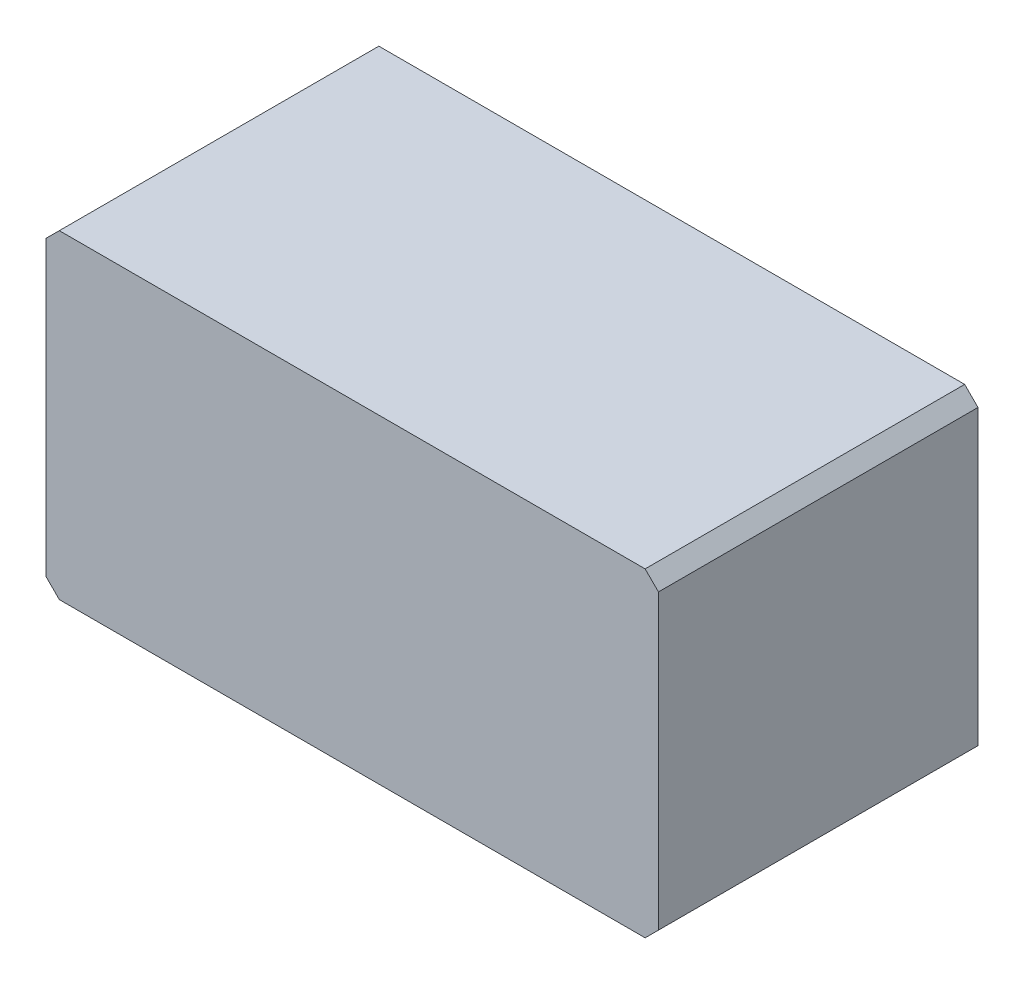
ISO-10303-21;
HEADER;
FILE_DESCRIPTION(('STEP AP214'),'2;1');
FILE_NAME('part.step','',(''),(''),'','','');
FILE_SCHEMA(('AUTOMOTIVE_DESIGN { 1 0 10303 214 1 1 1 1 }'));
ENDSEC;
DATA;
#1=APPLICATION_CONTEXT('core data for automotive mechanical design processes');
#2=APPLICATION_PROTOCOL_DEFINITION('international standard','automotive_design',2000,#1);
#3=PRODUCT_CONTEXT('',#1,'mechanical');
#4=PRODUCT('Part','Part','',(#3));
#5=PRODUCT_RELATED_PRODUCT_CATEGORY('part','',(#4));
#6=PRODUCT_DEFINITION_FORMATION('','',#4);
#7=PRODUCT_DEFINITION_CONTEXT('part definition',#1,'design');
#8=PRODUCT_DEFINITION('design','',#6,#7);
#9=PRODUCT_DEFINITION_SHAPE('','',#8);
#10=(LENGTH_UNIT() NAMED_UNIT(*) SI_UNIT(.MILLI.,.METRE.));
#11=(NAMED_UNIT(*) PLANE_ANGLE_UNIT() SI_UNIT($,.RADIAN.));
#12=(NAMED_UNIT(*) SI_UNIT($,.STERADIAN.) SOLID_ANGLE_UNIT());
#13=UNCERTAINTY_MEASURE_WITH_UNIT(LENGTH_MEASURE(1.E-05),#10,'distance_accuracy_value','');
#14=(GEOMETRIC_REPRESENTATION_CONTEXT(3) GLOBAL_UNCERTAINTY_ASSIGNED_CONTEXT((#13)) GLOBAL_UNIT_ASSIGNED_CONTEXT((#10,
#11,#12)) REPRESENTATION_CONTEXT('',''));
#15=CARTESIAN_POINT('',(0.,0.,0.));
#16=DIRECTION('',(0.,0.,1.));
#17=DIRECTION('',(1.,0.,0.));
#18=AXIS2_PLACEMENT_3D('',#15,#16,#17);
#19=CARTESIAN_POINT('',(-0.575,-0.275,0.6));
#20=DIRECTION('',(1.,0.,0.));
#21=DIRECTION('',(0.,0.,-1.));
#22=AXIS2_PLACEMENT_3D('',#19,#20,#21);
#23=PLANE('',#22);
#24=DIRECTION('',(0.,-1.,0.));
#25=VECTOR('',#24,1.);
#26=CARTESIAN_POINT('',(-0.575,-0.275,0.));
#27=LINE('',#26,#25);
#28=CARTESIAN_POINT('',(-0.575,0.275,0.));
#29=VERTEX_POINT('',#28);
#30=CARTESIAN_POINT('',(-0.575,-0.275,0.));
#31=VERTEX_POINT('',#30);
#32=EDGE_CURVE('E130',#29,#31,#27,.T.);
#33=ORIENTED_EDGE('',*,*,#32,.T.);
#34=DIRECTION('',(0.,0.,-1.));
#35=VECTOR('',#34,1.);
#36=CARTESIAN_POINT('',(-0.575,-0.275,0.6));
#37=LINE('',#36,#35);
#38=CARTESIAN_POINT('',(-0.575,-0.275,0.6));
#39=VERTEX_POINT('',#38);
#40=EDGE_CURVE('E11',#39,#31,#37,.T.);
#41=ORIENTED_EDGE('',*,*,#40,.F.);
#42=DIRECTION('',(0.,-1.,0.));
#43=VECTOR('',#42,1.);
#44=CARTESIAN_POINT('',(-0.575,-0.275,0.6));
#45=LINE('',#44,#43);
#46=CARTESIAN_POINT('',(-0.575,0.275,0.6));
#47=VERTEX_POINT('',#46);
#48=EDGE_CURVE('E144',#47,#39,#45,.T.);
#49=ORIENTED_EDGE('',*,*,#48,.F.);
#50=DIRECTION('',(0.,0.,-1.));
#51=VECTOR('',#50,1.);
#52=CARTESIAN_POINT('',(-0.575,0.275,0.6));
#53=LINE('',#52,#51);
#54=EDGE_CURVE('E126',#47,#29,#53,.T.);
#55=ORIENTED_EDGE('',*,*,#54,.T.);
#56=EDGE_LOOP('',(#33,#41,#49,#55));
#57=FACE_BOUND('',#56,.T.);
#58=ADVANCED_FACE('F34',(#57),#23,.F.);
#59=CARTESIAN_POINT('',(-0.55,-0.3,0.6));
#60=DIRECTION('',(0.707106781186547,0.707106781186547,0.));
#61=DIRECTION('',(-0.707106781186548,0.707106781186548,0.));
#62=AXIS2_PLACEMENT_3D('',#59,#60,#61);
#63=PLANE('',#62);
#64=DIRECTION('',(0.707106781186547,-0.707106781186547,0.));
#65=VECTOR('',#64,1.);
#66=CARTESIAN_POINT('',(-0.55,-0.3,0.));
#67=LINE('',#66,#65);
#68=CARTESIAN_POINT('',(-0.55,-0.3,0.));
#69=VERTEX_POINT('',#68);
#70=EDGE_CURVE('E133',#31,#69,#67,.T.);
#71=ORIENTED_EDGE('',*,*,#70,.T.);
#72=DIRECTION('',(0.,0.,-1.));
#73=VECTOR('',#72,1.);
#74=CARTESIAN_POINT('',(-0.55,-0.3,0.6));
#75=LINE('',#74,#73);
#76=CARTESIAN_POINT('',(-0.55,-0.3,0.6));
#77=VERTEX_POINT('',#76);
#78=EDGE_CURVE('E42',#77,#69,#75,.T.);
#79=ORIENTED_EDGE('',*,*,#78,.F.);
#80=DIRECTION('',(0.707106781186547,-0.707106781186547,0.));
#81=VECTOR('',#80,1.);
#82=CARTESIAN_POINT('',(-0.55,-0.3,0.6));
#83=LINE('',#82,#81);
#84=EDGE_CURVE('E93',#39,#77,#83,.T.);
#85=ORIENTED_EDGE('',*,*,#84,.F.);
#86=ORIENTED_EDGE('',*,*,#40,.T.);
#87=EDGE_LOOP('',(#71,#79,#85,#86));
#88=FACE_BOUND('',#87,.T.);
#89=ADVANCED_FACE('F179',(#88),#63,.F.);
#90=CARTESIAN_POINT('',(0.55,-0.3,0.6));
#91=DIRECTION('',(0.,1.,0.));
#92=DIRECTION('',(0.,0.,1.));
#93=AXIS2_PLACEMENT_3D('',#90,#91,#92);
#94=PLANE('',#93);
#95=DIRECTION('',(1.,0.,0.));
#96=VECTOR('',#95,1.);
#97=CARTESIAN_POINT('',(0.55,-0.3,0.));
#98=LINE('',#97,#96);
#99=CARTESIAN_POINT('',(0.55,-0.3,0.));
#100=VERTEX_POINT('',#99);
#101=EDGE_CURVE('E135',#69,#100,#98,.T.);
#102=ORIENTED_EDGE('',*,*,#101,.T.);
#103=DIRECTION('',(0.,0.,-1.));
#104=VECTOR('',#103,1.);
#105=CARTESIAN_POINT('',(0.55,-0.3,0.6));
#106=LINE('',#105,#104);
#107=CARTESIAN_POINT('',(0.55,-0.3,0.6));
#108=VERTEX_POINT('',#107);
#109=EDGE_CURVE('E151',#108,#100,#106,.T.);
#110=ORIENTED_EDGE('',*,*,#109,.F.);
#111=DIRECTION('',(1.,0.,0.));
#112=VECTOR('',#111,1.);
#113=CARTESIAN_POINT('',(0.55,-0.3,0.6));
#114=LINE('',#113,#112);
#115=EDGE_CURVE('E159',#77,#108,#114,.T.);
#116=ORIENTED_EDGE('',*,*,#115,.F.);
#117=ORIENTED_EDGE('',*,*,#78,.T.);
#118=EDGE_LOOP('',(#102,#110,#116,#117));
#119=FACE_BOUND('',#118,.T.);
#120=ADVANCED_FACE('F157',(#119),#94,.F.);
#121=CARTESIAN_POINT('',(0.575,-0.275,0.6));
#122=DIRECTION('',(-0.707106781186547,0.707106781186547,0.));
#123=DIRECTION('',(-0.707106781186548,-0.707106781186548,0.));
#124=AXIS2_PLACEMENT_3D('',#121,#122,#123);
#125=PLANE('',#124);
#126=DIRECTION('',(0.707106781186547,0.707106781186547,0.));
#127=VECTOR('',#126,1.);
#128=CARTESIAN_POINT('',(0.575,-0.275,0.));
#129=LINE('',#128,#127);
#130=CARTESIAN_POINT('',(0.575,-0.275,0.));
#131=VERTEX_POINT('',#130);
#132=EDGE_CURVE('E137',#100,#131,#129,.T.);
#133=ORIENTED_EDGE('',*,*,#132,.T.);
#134=DIRECTION('',(0.,0.,-1.));
#135=VECTOR('',#134,1.);
#136=CARTESIAN_POINT('',(0.575,-0.275,0.6));
#137=LINE('',#136,#135);
#138=CARTESIAN_POINT('',(0.575,-0.275,0.6));
#139=VERTEX_POINT('',#138);
#140=EDGE_CURVE('E148',#139,#131,#137,.T.);
#141=ORIENTED_EDGE('',*,*,#140,.F.);
#142=DIRECTION('',(0.707106781186547,0.707106781186547,0.));
#143=VECTOR('',#142,1.);
#144=CARTESIAN_POINT('',(0.575,-0.275,0.6));
#145=LINE('',#144,#143);
#146=EDGE_CURVE('E171',#108,#139,#145,.T.);
#147=ORIENTED_EDGE('',*,*,#146,.F.);
#148=ORIENTED_EDGE('',*,*,#109,.T.);
#149=EDGE_LOOP('',(#133,#141,#147,#148));
#150=FACE_BOUND('',#149,.T.);
#151=ADVANCED_FACE('F167',(#150),#125,.F.);
#152=CARTESIAN_POINT('',(0.575,0.275,0.6));
#153=DIRECTION('',(-1.,0.,0.));
#154=DIRECTION('',(0.,0.,1.));
#155=AXIS2_PLACEMENT_3D('',#152,#153,#154);
#156=PLANE('',#155);
#157=DIRECTION('',(0.,1.,0.));
#158=VECTOR('',#157,1.);
#159=CARTESIAN_POINT('',(0.575,0.275,0.));
#160=LINE('',#159,#158);
#161=CARTESIAN_POINT('',(0.575,0.275,0.));
#162=VERTEX_POINT('',#161);
#163=EDGE_CURVE('E139',#131,#162,#160,.T.);
#164=ORIENTED_EDGE('',*,*,#163,.T.);
#165=DIRECTION('',(0.,0.,-1.));
#166=VECTOR('',#165,1.);
#167=CARTESIAN_POINT('',(0.575,0.275,0.6));
#168=LINE('',#167,#166);
#169=CARTESIAN_POINT('',(0.575,0.275,0.6));
#170=VERTEX_POINT('',#169);
#171=EDGE_CURVE('E121',#170,#162,#168,.T.);
#172=ORIENTED_EDGE('',*,*,#171,.F.);
#173=DIRECTION('',(0.,1.,0.));
#174=VECTOR('',#173,1.);
#175=CARTESIAN_POINT('',(0.575,0.275,0.6));
#176=LINE('',#175,#174);
#177=EDGE_CURVE('E112',#139,#170,#176,.T.);
#178=ORIENTED_EDGE('',*,*,#177,.F.);
#179=ORIENTED_EDGE('',*,*,#140,.T.);
#180=EDGE_LOOP('',(#164,#172,#178,#179));
#181=FACE_BOUND('',#180,.T.);
#182=ADVANCED_FACE('F170',(#181),#156,.F.);
#183=CARTESIAN_POINT('',(0.55,0.3,0.6));
#184=DIRECTION('',(-0.707106781186547,-0.707106781186547,0.));
#185=DIRECTION('',(0.707106781186548,-0.707106781186548,0.));
#186=AXIS2_PLACEMENT_3D('',#183,#184,#185);
#187=PLANE('',#186);
#188=DIRECTION('',(-0.707106781186547,0.707106781186547,0.));
#189=VECTOR('',#188,1.);
#190=CARTESIAN_POINT('',(0.55,0.3,0.));
#191=LINE('',#190,#189);
#192=CARTESIAN_POINT('',(0.55,0.3,0.));
#193=VERTEX_POINT('',#192);
#194=EDGE_CURVE('E120',#162,#193,#191,.T.);
#195=ORIENTED_EDGE('',*,*,#194,.T.);
#196=DIRECTION('',(0.,0.,-1.));
#197=VECTOR('',#196,1.);
#198=CARTESIAN_POINT('',(0.55,0.3,0.6));
#199=LINE('',#198,#197);
#200=CARTESIAN_POINT('',(0.55,0.3,0.6));
#201=VERTEX_POINT('',#200);
#202=EDGE_CURVE('E117',#201,#193,#199,.T.);
#203=ORIENTED_EDGE('',*,*,#202,.F.);
#204=DIRECTION('',(-0.707106781186547,0.707106781186547,0.));
#205=VECTOR('',#204,1.);
#206=CARTESIAN_POINT('',(0.55,0.3,0.6));
#207=LINE('',#206,#205);
#208=EDGE_CURVE('E106',#170,#201,#207,.T.);
#209=ORIENTED_EDGE('',*,*,#208,.F.);
#210=ORIENTED_EDGE('',*,*,#171,.T.);
#211=EDGE_LOOP('',(#195,#203,#209,#210));
#212=FACE_BOUND('',#211,.T.);
#213=ADVANCED_FACE('F118',(#212),#187,.F.);
#214=CARTESIAN_POINT('',(-0.55,0.3,0.6));
#215=DIRECTION('',(0.,-1.,0.));
#216=DIRECTION('',(0.,0.,-1.));
#217=AXIS2_PLACEMENT_3D('',#214,#215,#216);
#218=PLANE('',#217);
#219=DIRECTION('',(-1.,0.,0.));
#220=VECTOR('',#219,1.);
#221=CARTESIAN_POINT('',(-0.55,0.3,0.));
#222=LINE('',#221,#220);
#223=CARTESIAN_POINT('',(-0.55,0.3,0.));
#224=VERTEX_POINT('',#223);
#225=EDGE_CURVE('E79',#193,#224,#222,.T.);
#226=ORIENTED_EDGE('',*,*,#225,.T.);
#227=DIRECTION('',(0.,0.,-1.));
#228=VECTOR('',#227,1.);
#229=CARTESIAN_POINT('',(-0.55,0.3,0.6));
#230=LINE('',#229,#228);
#231=CARTESIAN_POINT('',(-0.55,0.3,0.6));
#232=VERTEX_POINT('',#231);
#233=EDGE_CURVE('E122',#232,#224,#230,.T.);
#234=ORIENTED_EDGE('',*,*,#233,.F.);
#235=DIRECTION('',(-1.,0.,0.));
#236=VECTOR('',#235,1.);
#237=CARTESIAN_POINT('',(-0.55,0.3,0.6));
#238=LINE('',#237,#236);
#239=EDGE_CURVE('E110',#201,#232,#238,.T.);
#240=ORIENTED_EDGE('',*,*,#239,.F.);
#241=ORIENTED_EDGE('',*,*,#202,.T.);
#242=EDGE_LOOP('',(#226,#234,#240,#241));
#243=FACE_BOUND('',#242,.T.);
#244=ADVANCED_FACE('F124',(#243),#218,.F.);
#245=CARTESIAN_POINT('',(-0.575,0.275,0.6));
#246=DIRECTION('',(0.707106781186547,-0.707106781186547,0.));
#247=DIRECTION('',(0.707106781186548,0.707106781186548,0.));
#248=AXIS2_PLACEMENT_3D('',#245,#246,#247);
#249=PLANE('',#248);
#250=DIRECTION('',(-0.707106781186547,-0.707106781186547,0.));
#251=VECTOR('',#250,1.);
#252=CARTESIAN_POINT('',(-0.575,0.275,0.));
#253=LINE('',#252,#251);
#254=EDGE_CURVE('E85',#224,#29,#253,.T.);
#255=ORIENTED_EDGE('',*,*,#254,.T.);
#256=ORIENTED_EDGE('',*,*,#54,.F.);
#257=DIRECTION('',(-0.707106781186547,-0.707106781186547,0.));
#258=VECTOR('',#257,1.);
#259=CARTESIAN_POINT('',(-0.575,0.275,0.6));
#260=LINE('',#259,#258);
#261=EDGE_CURVE('E50',#232,#47,#260,.T.);
#262=ORIENTED_EDGE('',*,*,#261,.F.);
#263=ORIENTED_EDGE('',*,*,#233,.T.);
#264=EDGE_LOOP('',(#255,#256,#262,#263));
#265=FACE_BOUND('',#264,.T.);
#266=ADVANCED_FACE('F195',(#265),#249,.F.);
#267=CARTESIAN_POINT('',(0.,0.,0.6));
#268=DIRECTION('',(0.,0.,-1.));
#269=DIRECTION('',(-1.,0.,0.));
#270=AXIS2_PLACEMENT_3D('',#267,#268,#269);
#271=PLANE('',#270);
#272=ORIENTED_EDGE('',*,*,#48,.T.);
#273=ORIENTED_EDGE('',*,*,#84,.T.);
#274=ORIENTED_EDGE('',*,*,#115,.T.);
#275=ORIENTED_EDGE('',*,*,#146,.T.);
#276=ORIENTED_EDGE('',*,*,#177,.T.);
#277=ORIENTED_EDGE('',*,*,#208,.T.);
#278=ORIENTED_EDGE('',*,*,#239,.T.);
#279=ORIENTED_EDGE('',*,*,#261,.T.);
#280=EDGE_LOOP('',(#272,#273,#274,#275,#276,#277,#278,#279));
#281=FACE_BOUND('',#280,.T.);
#282=ADVANCED_FACE('F108',(#281),#271,.F.);
#283=CARTESIAN_POINT('',(0.,0.,0.));
#284=DIRECTION('',(0.,0.,-1.));
#285=DIRECTION('',(-1.,0.,0.));
#286=AXIS2_PLACEMENT_3D('',#283,#284,#285);
#287=PLANE('',#286);
#288=ORIENTED_EDGE('',*,*,#32,.F.);
#289=ORIENTED_EDGE('',*,*,#254,.F.);
#290=ORIENTED_EDGE('',*,*,#225,.F.);
#291=ORIENTED_EDGE('',*,*,#194,.F.);
#292=ORIENTED_EDGE('',*,*,#163,.F.);
#293=ORIENTED_EDGE('',*,*,#132,.F.);
#294=ORIENTED_EDGE('',*,*,#101,.F.);
#295=ORIENTED_EDGE('',*,*,#70,.F.);
#296=EDGE_LOOP('',(#288,#289,#290,#291,#292,#293,#294,#295));
#297=FACE_BOUND('',#296,.T.);
#298=ADVANCED_FACE('F163',(#297),#287,.T.);
#299=CLOSED_SHELL('',(#58,#89,#120,#151,#182,#213,#244,#266,#282,#298));
#300=MANIFOLD_SOLID_BREP('B2',#299);
#301=ADVANCED_BREP_SHAPE_REPRESENTATION('',(#18,#300),#14);
#302=SHAPE_DEFINITION_REPRESENTATION(#9,#301);
ENDSEC;
END-ISO-10303-21;
